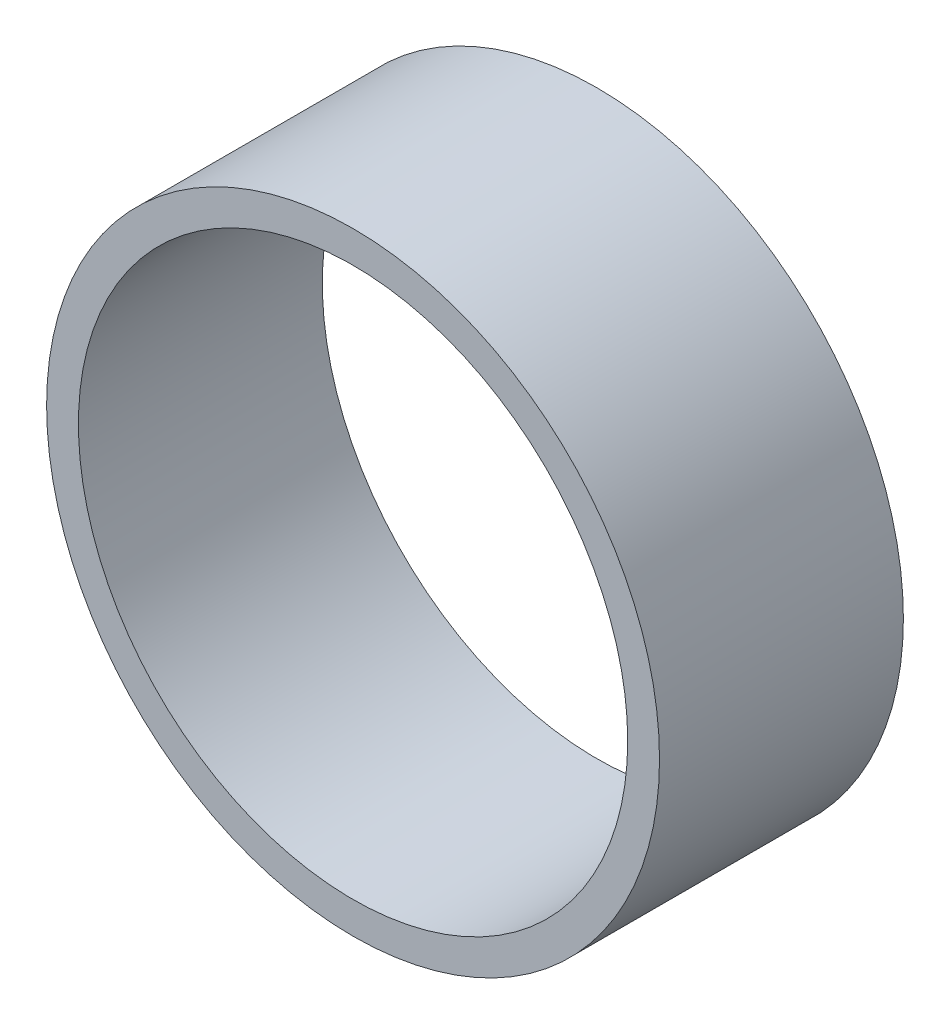
ISO-10303-21;
HEADER;
FILE_DESCRIPTION(('STEP AP214'),'2;1');
FILE_NAME('part.step','',(''),(''),'','','');
FILE_SCHEMA(('AUTOMOTIVE_DESIGN { 1 0 10303 214 1 1 1 1 }'));
ENDSEC;
DATA;
#1=APPLICATION_CONTEXT('core data for automotive mechanical design processes');
#2=APPLICATION_PROTOCOL_DEFINITION('international standard','automotive_design',2000,#1);
#3=PRODUCT_CONTEXT('',#1,'mechanical');
#4=PRODUCT('Part','Part','',(#3));
#5=PRODUCT_RELATED_PRODUCT_CATEGORY('part','',(#4));
#6=PRODUCT_DEFINITION_FORMATION('','',#4);
#7=PRODUCT_DEFINITION_CONTEXT('part definition',#1,'design');
#8=PRODUCT_DEFINITION('design','',#6,#7);
#9=PRODUCT_DEFINITION_SHAPE('','',#8);
#10=(LENGTH_UNIT() NAMED_UNIT(*) SI_UNIT(.MILLI.,.METRE.));
#11=(NAMED_UNIT(*) PLANE_ANGLE_UNIT() SI_UNIT($,.RADIAN.));
#12=(NAMED_UNIT(*) SI_UNIT($,.STERADIAN.) SOLID_ANGLE_UNIT());
#13=UNCERTAINTY_MEASURE_WITH_UNIT(LENGTH_MEASURE(1.E-05),#10,'distance_accuracy_value','');
#14=(GEOMETRIC_REPRESENTATION_CONTEXT(3) GLOBAL_UNCERTAINTY_ASSIGNED_CONTEXT((#13)) GLOBAL_UNIT_ASSIGNED_CONTEXT((#10,
#11,#12)) REPRESENTATION_CONTEXT('',''));
#15=CARTESIAN_POINT('',(0.,0.,0.));
#16=DIRECTION('',(0.,0.,1.));
#17=DIRECTION('',(1.,0.,0.));
#18=AXIS2_PLACEMENT_3D('',#15,#16,#17);
#19=CARTESIAN_POINT('',(0.,0.,12.));
#20=DIRECTION('',(0.,0.,1.));
#21=DIRECTION('',(1.,0.,0.));
#22=AXIS2_PLACEMENT_3D('',#19,#20,#21);
#23=PLANE('',#22);
#24=CARTESIAN_POINT('',(0.,0.,12.));
#25=DIRECTION('',(0.,0.,1.));
#26=DIRECTION('',(1.,0.,0.));
#27=AXIS2_PLACEMENT_3D('',#24,#25,#26);
#28=CIRCLE('',#27,15.08);
#29=CARTESIAN_POINT('',(15.08,0.,12.));
#30=VERTEX_POINT('',#29);
#31=EDGE_CURVE('E10',#30,#30,#28,.T.);
#32=ORIENTED_EDGE('',*,*,#31,.T.);
#33=EDGE_LOOP('',(#32));
#34=FACE_BOUND('',#33,.T.);
#35=CARTESIAN_POINT('',(0.,0.,12.));
#36=DIRECTION('',(0.,0.,1.));
#37=DIRECTION('',(1.,0.,0.));
#38=AXIS2_PLACEMENT_3D('',#35,#36,#37);
#39=CIRCLE('',#38,13.515);
#40=CARTESIAN_POINT('',(13.515,0.,12.));
#41=VERTEX_POINT('',#40);
#42=EDGE_CURVE('E41',#41,#41,#39,.T.);
#43=ORIENTED_EDGE('',*,*,#42,.F.);
#44=EDGE_LOOP('',(#43));
#45=FACE_BOUND('',#44,.T.);
#46=ADVANCED_FACE('F30',(#34,#45),#23,.T.);
#47=CARTESIAN_POINT('',(0.,0.,0.));
#48=DIRECTION('',(0.,0.,1.));
#49=DIRECTION('',(1.,0.,0.));
#50=AXIS2_PLACEMENT_3D('',#47,#48,#49);
#51=PLANE('',#50);
#52=CARTESIAN_POINT('',(0.,0.,0.));
#53=DIRECTION('',(0.,0.,1.));
#54=DIRECTION('',(1.,0.,0.));
#55=AXIS2_PLACEMENT_3D('',#52,#53,#54);
#56=CIRCLE('',#55,15.08);
#57=CARTESIAN_POINT('',(15.08,0.,0.));
#58=VERTEX_POINT('',#57);
#59=EDGE_CURVE('E34',#58,#58,#56,.T.);
#60=ORIENTED_EDGE('',*,*,#59,.F.);
#61=EDGE_LOOP('',(#60));
#62=FACE_BOUND('',#61,.T.);
#63=CARTESIAN_POINT('',(0.,0.,0.));
#64=DIRECTION('',(0.,0.,1.));
#65=DIRECTION('',(1.,0.,0.));
#66=AXIS2_PLACEMENT_3D('',#63,#64,#65);
#67=CIRCLE('',#66,13.515);
#68=CARTESIAN_POINT('',(13.515,0.,0.));
#69=VERTEX_POINT('',#68);
#70=EDGE_CURVE('E43',#69,#69,#67,.T.);
#71=ORIENTED_EDGE('',*,*,#70,.T.);
#72=EDGE_LOOP('',(#71));
#73=FACE_BOUND('',#72,.T.);
#74=ADVANCED_FACE('F53',(#62,#73),#51,.F.);
#75=CARTESIAN_POINT('',(0.,0.,12.));
#76=DIRECTION('',(0.,0.,-1.));
#77=DIRECTION('',(-1.,0.,0.));
#78=AXIS2_PLACEMENT_3D('',#75,#76,#77);
#79=CYLINDRICAL_SURFACE('',#78,15.08);
#80=ORIENTED_EDGE('',*,*,#31,.F.);
#81=EDGE_LOOP('',(#80));
#82=FACE_BOUND('',#81,.T.);
#83=ORIENTED_EDGE('',*,*,#59,.T.);
#84=EDGE_LOOP('',(#83));
#85=FACE_BOUND('',#84,.T.);
#86=ADVANCED_FACE('F32',(#82,#85),#79,.T.);
#87=CARTESIAN_POINT('',(0.,0.,12.));
#88=DIRECTION('',(0.,0.,-1.));
#89=DIRECTION('',(-1.,0.,0.));
#90=AXIS2_PLACEMENT_3D('',#87,#88,#89);
#91=CYLINDRICAL_SURFACE('',#90,13.515);
#92=ORIENTED_EDGE('',*,*,#42,.T.);
#93=EDGE_LOOP('',(#92));
#94=FACE_BOUND('',#93,.T.);
#95=ORIENTED_EDGE('',*,*,#70,.F.);
#96=EDGE_LOOP('',(#95));
#97=FACE_BOUND('',#96,.T.);
#98=ADVANCED_FACE('F49',(#94,#97),#91,.F.);
#99=CLOSED_SHELL('',(#46,#74,#86,#98));
#100=MANIFOLD_SOLID_BREP('B2',#99);
#101=ADVANCED_BREP_SHAPE_REPRESENTATION('',(#18,#100),#14);
#102=SHAPE_DEFINITION_REPRESENTATION(#9,#101);
ENDSEC;
END-ISO-10303-21;
